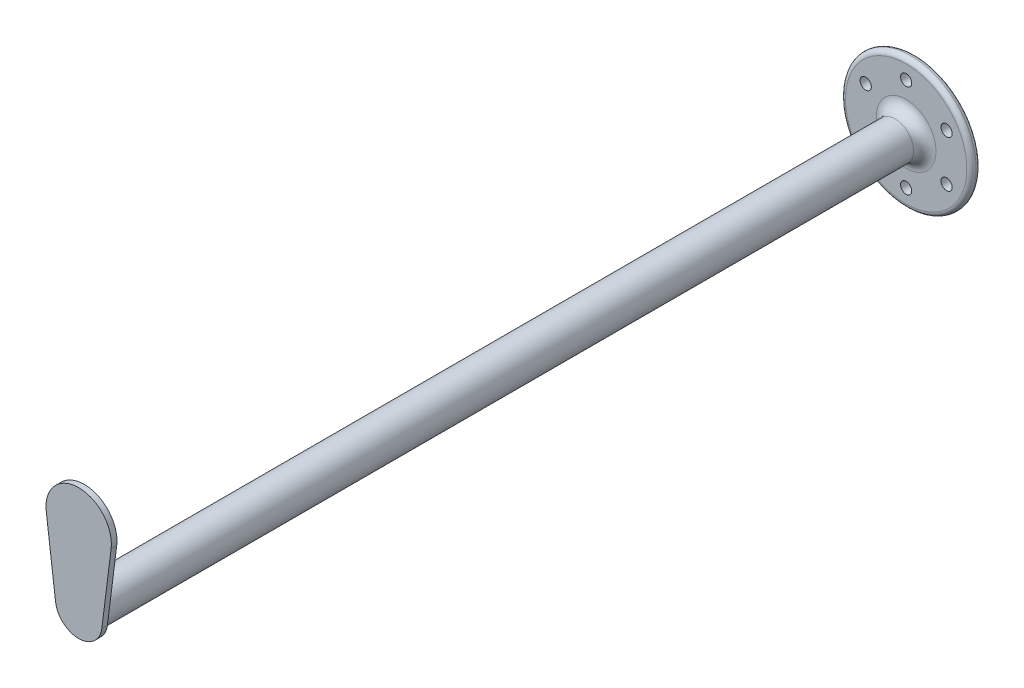
ISO-10303-21;
HEADER;
FILE_DESCRIPTION(('STEP AP214'),'2;1');
FILE_NAME('part.step','',(''),(''),'','','');
FILE_SCHEMA(('AUTOMOTIVE_DESIGN { 1 0 10303 214 1 1 1 1 }'));
ENDSEC;
DATA;
#1=APPLICATION_CONTEXT('core data for automotive mechanical design processes');
#2=APPLICATION_PROTOCOL_DEFINITION('international standard','automotive_design',2000,#1);
#3=PRODUCT_CONTEXT('',#1,'mechanical');
#4=PRODUCT('Part','Part','',(#3));
#5=PRODUCT_RELATED_PRODUCT_CATEGORY('part','',(#4));
#6=PRODUCT_DEFINITION_FORMATION('','',#4);
#7=PRODUCT_DEFINITION_CONTEXT('part definition',#1,'design');
#8=PRODUCT_DEFINITION('design','',#6,#7);
#9=PRODUCT_DEFINITION_SHAPE('','',#8);
#10=(LENGTH_UNIT() NAMED_UNIT(*) SI_UNIT(.MILLI.,.METRE.));
#11=(NAMED_UNIT(*) PLANE_ANGLE_UNIT() SI_UNIT($,.RADIAN.));
#12=(NAMED_UNIT(*) SI_UNIT($,.STERADIAN.) SOLID_ANGLE_UNIT());
#13=UNCERTAINTY_MEASURE_WITH_UNIT(LENGTH_MEASURE(1.E-05),#10,'distance_accuracy_value','');
#14=(GEOMETRIC_REPRESENTATION_CONTEXT(3) GLOBAL_UNCERTAINTY_ASSIGNED_CONTEXT((#13)) GLOBAL_UNIT_ASSIGNED_CONTEXT((#10,
#11,#12)) REPRESENTATION_CONTEXT('',''));
#15=CARTESIAN_POINT('',(0.,0.,0.));
#16=DIRECTION('',(0.,0.,1.));
#17=DIRECTION('',(1.,0.,0.));
#18=AXIS2_PLACEMENT_3D('',#15,#16,#17);
#19=CARTESIAN_POINT('',(0.,0.,558.8));
#20=DIRECTION('',(0.,0.,-1.));
#21=DIRECTION('',(-1.,0.,0.));
#22=AXIS2_PLACEMENT_3D('',#19,#20,#21);
#23=CYLINDRICAL_SURFACE('',#22,12.7);
#24=CARTESIAN_POINT('',(0.,0.,557.53));
#25=DIRECTION('',(0.,0.,1.));
#26=DIRECTION('',(1.,0.,0.));
#27=AXIS2_PLACEMENT_3D('',#24,#25,#26);
#28=CIRCLE('',#27,12.7);
#29=CARTESIAN_POINT('',(12.7,0.,557.53));
#30=VERTEX_POINT('',#29);
#31=EDGE_CURVE('E11',#30,#30,#28,.F.);
#32=ORIENTED_EDGE('',*,*,#31,.T.);
#33=EDGE_LOOP('',(#32));
#34=FACE_BOUND('',#33,.T.);
#35=CARTESIAN_POINT('',(0.,0.,7.61999999999996));
#36=DIRECTION('',(0.,0.,-1.));
#37=DIRECTION('',(-1.,0.,0.));
#38=AXIS2_PLACEMENT_3D('',#35,#36,#37);
#39=CIRCLE('',#38,12.7);
#40=CARTESIAN_POINT('',(-12.7,0.,7.61999999999996));
#41=VERTEX_POINT('',#40);
#42=EDGE_CURVE('E150',#41,#41,#39,.F.);
#43=ORIENTED_EDGE('',*,*,#42,.T.);
#44=EDGE_LOOP('',(#43));
#45=FACE_BOUND('',#44,.T.);
#46=ADVANCED_FACE('F33',(#34,#45),#23,.T.);
#47=CARTESIAN_POINT('',(0.,0.,-6.35));
#48=DIRECTION('',(0.,0.,-1.));
#49=DIRECTION('',(-1.,0.,0.));
#50=AXIS2_PLACEMENT_3D('',#47,#48,#49);
#51=PLANE('',#50);
#52=CARTESIAN_POINT('',(0.,0.,-6.35));
#53=DIRECTION('',(0.,0.,-1.));
#54=DIRECTION('',(-1.,0.,0.));
#55=AXIS2_PLACEMENT_3D('',#52,#53,#54);
#56=CIRCLE('',#55,41.275);
#57=CARTESIAN_POINT('',(-41.275,0.,-6.35));
#58=VERTEX_POINT('',#57);
#59=EDGE_CURVE('E153',#58,#58,#56,.T.);
#60=ORIENTED_EDGE('',*,*,#59,.T.);
#61=EDGE_LOOP('',(#60));
#62=FACE_BOUND('',#61,.T.);
#63=CARTESIAN_POINT('',(27.4963065701532,-15.8750000000016,-6.35));
#64=DIRECTION('',(0.,0.,-1.));
#65=DIRECTION('',(-1.,0.,0.));
#66=AXIS2_PLACEMENT_3D('',#63,#64,#65);
#67=CIRCLE('',#66,3.81000000000333);
#68=CARTESIAN_POINT('',(23.6863065701499,-15.8750000000016,-6.35));
#69=VERTEX_POINT('',#68);
#70=EDGE_CURVE('E118',#69,#69,#67,.T.);
#71=ORIENTED_EDGE('',*,*,#70,.F.);
#72=EDGE_LOOP('',(#71));
#73=FACE_BOUND('',#72,.T.);
#74=CARTESIAN_POINT('',(-27.4963065701586,-15.8749999999984,-6.35));
#75=DIRECTION('',(0.,0.,-1.));
#76=DIRECTION('',(-1.,0.,0.));
#77=AXIS2_PLACEMENT_3D('',#74,#75,#76);
#78=CIRCLE('',#77,3.81000000000228);
#79=CARTESIAN_POINT('',(-31.3063065701609,-15.8749999999984,-6.35));
#80=VERTEX_POINT('',#79);
#81=EDGE_CURVE('E130',#80,#80,#78,.T.);
#82=ORIENTED_EDGE('',*,*,#81,.F.);
#83=EDGE_LOOP('',(#82));
#84=FACE_BOUND('',#83,.T.);
#85=CARTESIAN_POINT('',(0.,31.75,-6.35));
#86=DIRECTION('',(0.,0.,-1.));
#87=DIRECTION('',(-1.,0.,0.));
#88=AXIS2_PLACEMENT_3D('',#85,#86,#87);
#89=CIRCLE('',#88,3.81);
#90=CARTESIAN_POINT('',(-3.81,31.75,-6.35));
#91=VERTEX_POINT('',#90);
#92=EDGE_CURVE('E142',#91,#91,#89,.T.);
#93=ORIENTED_EDGE('',*,*,#92,.F.);
#94=EDGE_LOOP('',(#93));
#95=FACE_BOUND('',#94,.T.);
#96=CARTESIAN_POINT('',(-27.4963065701568,15.8750000000016,-6.35));
#97=DIRECTION('',(0.,0.,-1.));
#98=DIRECTION('',(-1.,0.,0.));
#99=AXIS2_PLACEMENT_3D('',#96,#97,#98);
#100=CIRCLE('',#99,3.81000000000048);
#101=CARTESIAN_POINT('',(-31.3063065701573,15.8750000000016,-6.35));
#102=VERTEX_POINT('',#101);
#103=EDGE_CURVE('E136',#102,#102,#100,.T.);
#104=ORIENTED_EDGE('',*,*,#103,.F.);
#105=EDGE_LOOP('',(#104));
#106=FACE_BOUND('',#105,.T.);
#107=CARTESIAN_POINT('',(-3.60178059048672E-12,-31.75,-6.35));
#108=DIRECTION('',(0.,0.,-1.));
#109=DIRECTION('',(-1.,0.,0.));
#110=AXIS2_PLACEMENT_3D('',#107,#108,#109);
#111=CIRCLE('',#110,3.81000000000366);
#112=CARTESIAN_POINT('',(-3.81000000000726,-31.75,-6.35));
#113=VERTEX_POINT('',#112);
#114=EDGE_CURVE('E124',#113,#113,#111,.T.);
#115=ORIENTED_EDGE('',*,*,#114,.F.);
#116=EDGE_LOOP('',(#115));
#117=FACE_BOUND('',#116,.T.);
#118=CARTESIAN_POINT('',(27.496306570155,15.8749999999984,-6.35));
#119=DIRECTION('',(0.,0.,-1.));
#120=DIRECTION('',(-1.,0.,0.));
#121=AXIS2_PLACEMENT_3D('',#118,#119,#120);
#122=CIRCLE('',#121,3.8100000000017);
#123=CARTESIAN_POINT('',(23.6863065701533,15.8749999999984,-6.35));
#124=VERTEX_POINT('',#123);
#125=EDGE_CURVE('E111',#124,#124,#122,.T.);
#126=ORIENTED_EDGE('',*,*,#125,.F.);
#127=EDGE_LOOP('',(#126));
#128=FACE_BOUND('',#127,.T.);
#129=ADVANCED_FACE('F174',(#62,#73,#84,#95,#106,#117,#128),#51,.T.);
#130=CARTESIAN_POINT('',(0.,0.,0.));
#131=DIRECTION('',(0.,0.,-1.));
#132=DIRECTION('',(-1.,0.,0.));
#133=AXIS2_PLACEMENT_3D('',#130,#131,#132);
#134=PLANE('',#133);
#135=CARTESIAN_POINT('',(0.,0.,0.));
#136=DIRECTION('',(0.,0.,-1.));
#137=DIRECTION('',(-1.,0.,0.));
#138=AXIS2_PLACEMENT_3D('',#135,#136,#137);
#139=CIRCLE('',#138,41.275);
#140=CARTESIAN_POINT('',(-41.275,0.,0.));
#141=VERTEX_POINT('',#140);
#142=EDGE_CURVE('E156',#141,#141,#139,.F.);
#143=ORIENTED_EDGE('',*,*,#142,.T.);
#144=EDGE_LOOP('',(#143));
#145=FACE_BOUND('',#144,.T.);
#146=CARTESIAN_POINT('',(0.,0.,0.));
#147=DIRECTION('',(0.,0.,-1.));
#148=DIRECTION('',(-1.,0.,0.));
#149=AXIS2_PLACEMENT_3D('',#146,#147,#148);
#150=CIRCLE('',#149,20.32);
#151=CARTESIAN_POINT('',(-20.32,0.,0.));
#152=VERTEX_POINT('',#151);
#153=EDGE_CURVE('E145',#152,#152,#150,.T.);
#154=ORIENTED_EDGE('',*,*,#153,.T.);
#155=EDGE_LOOP('',(#154));
#156=FACE_BOUND('',#155,.T.);
#157=CARTESIAN_POINT('',(0.,31.75,0.));
#158=DIRECTION('',(0.,0.,-1.));
#159=DIRECTION('',(-1.,0.,0.));
#160=AXIS2_PLACEMENT_3D('',#157,#158,#159);
#161=CIRCLE('',#160,3.81);
#162=CARTESIAN_POINT('',(-3.81,31.75,0.));
#163=VERTEX_POINT('',#162);
#164=EDGE_CURVE('E139',#163,#163,#161,.T.);
#165=ORIENTED_EDGE('',*,*,#164,.T.);
#166=EDGE_LOOP('',(#165));
#167=FACE_BOUND('',#166,.T.);
#168=CARTESIAN_POINT('',(-27.4963065701568,15.8750000000016,0.));
#169=DIRECTION('',(0.,0.,-1.));
#170=DIRECTION('',(-1.,0.,0.));
#171=AXIS2_PLACEMENT_3D('',#168,#169,#170);
#172=CIRCLE('',#171,3.81000000000048);
#173=CARTESIAN_POINT('',(-31.3063065701573,15.8750000000016,0.));
#174=VERTEX_POINT('',#173);
#175=EDGE_CURVE('E133',#174,#174,#172,.T.);
#176=ORIENTED_EDGE('',*,*,#175,.T.);
#177=EDGE_LOOP('',(#176));
#178=FACE_BOUND('',#177,.T.);
#179=CARTESIAN_POINT('',(-27.4963065701586,-15.8749999999984,0.));
#180=DIRECTION('',(0.,0.,-1.));
#181=DIRECTION('',(-1.,0.,0.));
#182=AXIS2_PLACEMENT_3D('',#179,#180,#181);
#183=CIRCLE('',#182,3.81000000000228);
#184=CARTESIAN_POINT('',(-31.3063065701609,-15.8749999999984,0.));
#185=VERTEX_POINT('',#184);
#186=EDGE_CURVE('E127',#185,#185,#183,.T.);
#187=ORIENTED_EDGE('',*,*,#186,.T.);
#188=EDGE_LOOP('',(#187));
#189=FACE_BOUND('',#188,.T.);
#190=CARTESIAN_POINT('',(-3.60178059048672E-12,-31.75,0.));
#191=DIRECTION('',(0.,0.,-1.));
#192=DIRECTION('',(-1.,0.,0.));
#193=AXIS2_PLACEMENT_3D('',#190,#191,#192);
#194=CIRCLE('',#193,3.81000000000366);
#195=CARTESIAN_POINT('',(-3.81000000000726,-31.75,0.));
#196=VERTEX_POINT('',#195);
#197=EDGE_CURVE('E121',#196,#196,#194,.T.);
#198=ORIENTED_EDGE('',*,*,#197,.T.);
#199=EDGE_LOOP('',(#198));
#200=FACE_BOUND('',#199,.T.);
#201=CARTESIAN_POINT('',(27.4963065701532,-15.8750000000016,0.));
#202=DIRECTION('',(0.,0.,-1.));
#203=DIRECTION('',(-1.,0.,0.));
#204=AXIS2_PLACEMENT_3D('',#201,#202,#203);
#205=CIRCLE('',#204,3.81000000000333);
#206=CARTESIAN_POINT('',(23.6863065701499,-15.8750000000016,0.));
#207=VERTEX_POINT('',#206);
#208=EDGE_CURVE('E114',#207,#207,#205,.T.);
#209=ORIENTED_EDGE('',*,*,#208,.T.);
#210=EDGE_LOOP('',(#209));
#211=FACE_BOUND('',#210,.T.);
#212=CARTESIAN_POINT('',(27.496306570155,15.8749999999984,0.));
#213=DIRECTION('',(0.,0.,-1.));
#214=DIRECTION('',(-1.,0.,0.));
#215=AXIS2_PLACEMENT_3D('',#212,#213,#214);
#216=CIRCLE('',#215,3.8100000000017);
#217=CARTESIAN_POINT('',(23.6863065701533,15.8749999999984,0.));
#218=VERTEX_POINT('',#217);
#219=EDGE_CURVE('E115',#218,#218,#216,.T.);
#220=ORIENTED_EDGE('',*,*,#219,.T.);
#221=EDGE_LOOP('',(#220));
#222=FACE_BOUND('',#221,.T.);
#223=ADVANCED_FACE('F180',(#145,#156,#167,#178,#189,#200,#211,#222),#134,.F.);
#224=CARTESIAN_POINT('',(0.,31.75,-6.35));
#225=DIRECTION('',(0.,0.,1.));
#226=DIRECTION('',(1.,0.,0.));
#227=AXIS2_PLACEMENT_3D('',#224,#225,#226);
#228=CYLINDRICAL_SURFACE('',#227,3.81);
#229=ORIENTED_EDGE('',*,*,#92,.T.);
#230=EDGE_LOOP('',(#229));
#231=FACE_BOUND('',#230,.T.);
#232=ORIENTED_EDGE('',*,*,#164,.F.);
#233=EDGE_LOOP('',(#232));
#234=FACE_BOUND('',#233,.T.);
#235=ADVANCED_FACE('F225',(#231,#234),#228,.F.);
#236=CARTESIAN_POINT('',(-27.4963065701568,15.8750000000016,-6.35));
#237=DIRECTION('',(0.,0.,1.));
#238=DIRECTION('',(1.,0.,0.));
#239=AXIS2_PLACEMENT_3D('',#236,#237,#238);
#240=CYLINDRICAL_SURFACE('',#239,3.81000000000048);
#241=ORIENTED_EDGE('',*,*,#103,.T.);
#242=EDGE_LOOP('',(#241));
#243=FACE_BOUND('',#242,.T.);
#244=ORIENTED_EDGE('',*,*,#175,.F.);
#245=EDGE_LOOP('',(#244));
#246=FACE_BOUND('',#245,.T.);
#247=ADVANCED_FACE('F230',(#243,#246),#240,.F.);
#248=CARTESIAN_POINT('',(-27.4963065701586,-15.8749999999984,-6.35));
#249=DIRECTION('',(0.,0.,1.));
#250=DIRECTION('',(1.,0.,0.));
#251=AXIS2_PLACEMENT_3D('',#248,#249,#250);
#252=CYLINDRICAL_SURFACE('',#251,3.81000000000228);
#253=ORIENTED_EDGE('',*,*,#81,.T.);
#254=EDGE_LOOP('',(#253));
#255=FACE_BOUND('',#254,.T.);
#256=ORIENTED_EDGE('',*,*,#186,.F.);
#257=EDGE_LOOP('',(#256));
#258=FACE_BOUND('',#257,.T.);
#259=ADVANCED_FACE('F253',(#255,#258),#252,.F.);
#260=CARTESIAN_POINT('',(-3.60178059048672E-12,-31.75,-6.35));
#261=DIRECTION('',(0.,0.,1.));
#262=DIRECTION('',(1.,0.,0.));
#263=AXIS2_PLACEMENT_3D('',#260,#261,#262);
#264=CYLINDRICAL_SURFACE('',#263,3.81000000000366);
#265=ORIENTED_EDGE('',*,*,#114,.T.);
#266=EDGE_LOOP('',(#265));
#267=FACE_BOUND('',#266,.T.);
#268=ORIENTED_EDGE('',*,*,#197,.F.);
#269=EDGE_LOOP('',(#268));
#270=FACE_BOUND('',#269,.T.);
#271=ADVANCED_FACE('F247',(#267,#270),#264,.F.);
#272=CARTESIAN_POINT('',(27.4963065701532,-15.8750000000016,-6.35));
#273=DIRECTION('',(0.,0.,1.));
#274=DIRECTION('',(1.,0.,0.));
#275=AXIS2_PLACEMENT_3D('',#272,#273,#274);
#276=CYLINDRICAL_SURFACE('',#275,3.81000000000333);
#277=ORIENTED_EDGE('',*,*,#70,.T.);
#278=EDGE_LOOP('',(#277));
#279=FACE_BOUND('',#278,.T.);
#280=ORIENTED_EDGE('',*,*,#208,.F.);
#281=EDGE_LOOP('',(#280));
#282=FACE_BOUND('',#281,.T.);
#283=ADVANCED_FACE('F220',(#279,#282),#276,.F.);
#284=CARTESIAN_POINT('',(27.496306570155,15.8749999999984,-6.35));
#285=DIRECTION('',(0.,0.,1.));
#286=DIRECTION('',(1.,0.,0.));
#287=AXIS2_PLACEMENT_3D('',#284,#285,#286);
#288=CYLINDRICAL_SURFACE('',#287,3.8100000000017);
#289=ORIENTED_EDGE('',*,*,#125,.T.);
#290=EDGE_LOOP('',(#289));
#291=FACE_BOUND('',#290,.T.);
#292=ORIENTED_EDGE('',*,*,#219,.F.);
#293=EDGE_LOOP('',(#292));
#294=FACE_BOUND('',#293,.T.);
#295=ADVANCED_FACE('F190',(#291,#294),#288,.F.);
#296=CARTESIAN_POINT('',(0.,0.,7.61999999999996));
#297=DIRECTION('',(0.,0.,-1.));
#298=DIRECTION('',(-1.,0.,0.));
#299=AXIS2_PLACEMENT_3D('',#296,#297,#298);
#300=TOROIDAL_SURFACE('',#299,20.32,7.62);
#301=ORIENTED_EDGE('',*,*,#42,.F.);
#302=EDGE_LOOP('',(#301));
#303=FACE_BOUND('',#302,.T.);
#304=ORIENTED_EDGE('',*,*,#153,.F.);
#305=EDGE_LOOP('',(#304));
#306=FACE_BOUND('',#305,.T.);
#307=ADVANCED_FACE('F186',(#303,#306),#300,.F.);
#308=CARTESIAN_POINT('',(0.,0.,-3.175));
#309=DIRECTION('',(0.,0.,-1.));
#310=DIRECTION('',(-1.,0.,0.));
#311=AXIS2_PLACEMENT_3D('',#308,#309,#310);
#312=TOROIDAL_SURFACE('',#311,41.275,3.175);
#313=ORIENTED_EDGE('',*,*,#142,.F.);
#314=EDGE_LOOP('',(#313));
#315=FACE_BOUND('',#314,.T.);
#316=CARTESIAN_POINT('',(0.,0.,-3.175));
#317=DIRECTION('',(0.,0.,-1.));
#318=DIRECTION('',(-1.,0.,0.));
#319=AXIS2_PLACEMENT_3D('',#316,#317,#318);
#320=CIRCLE('',#319,44.45);
#321=CARTESIAN_POINT('',(-44.45,0.,-3.175));
#322=VERTEX_POINT('',#321);
#323=EDGE_CURVE('E110',#322,#322,#320,.T.);
#324=ORIENTED_EDGE('',*,*,#323,.F.);
#325=EDGE_LOOP('',(#324));
#326=FACE_BOUND('',#325,.T.);
#327=ADVANCED_FACE('F189',(#315,#326),#312,.T.);
#328=CARTESIAN_POINT('',(0.,0.,-3.175));
#329=DIRECTION('',(0.,0.,-1.));
#330=DIRECTION('',(-1.,0.,0.));
#331=AXIS2_PLACEMENT_3D('',#328,#329,#330);
#332=TOROIDAL_SURFACE('',#331,41.275,3.175);
#333=ORIENTED_EDGE('',*,*,#323,.T.);
#334=EDGE_LOOP('',(#333));
#335=FACE_BOUND('',#334,.T.);
#336=ORIENTED_EDGE('',*,*,#59,.F.);
#337=EDGE_LOOP('',(#336));
#338=FACE_BOUND('',#337,.T.);
#339=ADVANCED_FACE('F192',(#335,#338),#332,.T.);
#340=CARTESIAN_POINT('',(0.,0.,562.61));
#341=DIRECTION('',(0.,0.,-1.));
#342=DIRECTION('',(-1.,0.,0.));
#343=AXIS2_PLACEMENT_3D('',#340,#341,#342);
#344=CYLINDRICAL_SURFACE('',#343,15.875);
#345=CARTESIAN_POINT('',(0.,0.,558.8));
#346=DIRECTION('',(0.,0.,1.));
#347=DIRECTION('',(1.,0.,0.));
#348=AXIS2_PLACEMENT_3D('',#345,#346,#347);
#349=CIRCLE('',#348,15.875);
#350=CARTESIAN_POINT('',(-15.7504882736814,-1.984375,558.8));
#351=VERTEX_POINT('',#350);
#352=CARTESIAN_POINT('',(15.7504882736814,-1.984375,558.8));
#353=VERTEX_POINT('',#352);
#354=EDGE_CURVE('E101',#351,#353,#349,.T.);
#355=ORIENTED_EDGE('',*,*,#354,.T.);
#356=DIRECTION('',(0.,0.,-1.));
#357=VECTOR('',#356,1.);
#358=CARTESIAN_POINT('',(15.7504882736814,-1.984375,562.61));
#359=LINE('',#358,#357);
#360=CARTESIAN_POINT('',(15.7504882736814,-1.984375,562.61));
#361=VERTEX_POINT('',#360);
#362=EDGE_CURVE('E92',#361,#353,#359,.T.);
#363=ORIENTED_EDGE('',*,*,#362,.F.);
#364=CARTESIAN_POINT('',(0.,0.,562.61));
#365=DIRECTION('',(0.,0.,1.));
#366=DIRECTION('',(1.,0.,0.));
#367=AXIS2_PLACEMENT_3D('',#364,#365,#366);
#368=CIRCLE('',#367,15.875);
#369=CARTESIAN_POINT('',(-15.7504882736814,-1.984375,562.61));
#370=VERTEX_POINT('',#369);
#371=EDGE_CURVE('E86',#370,#361,#368,.T.);
#372=ORIENTED_EDGE('',*,*,#371,.F.);
#373=DIRECTION('',(0.,0.,-1.));
#374=VECTOR('',#373,1.);
#375=CARTESIAN_POINT('',(-15.7504882736814,-1.984375,562.61));
#376=LINE('',#375,#374);
#377=EDGE_CURVE('E97',#370,#351,#376,.T.);
#378=ORIENTED_EDGE('',*,*,#377,.T.);
#379=EDGE_LOOP('',(#355,#363,#372,#378));
#380=FACE_BOUND('',#379,.T.);
#381=ADVANCED_FACE('F194',(#380),#344,.T.);
#382=CARTESIAN_POINT('',(15.7504882736814,-1.984375,562.61));
#383=DIRECTION('',(-0.992156741649222,0.125,0.));
#384=DIRECTION('',(-0.125,-0.992156741649222,0.));
#385=AXIS2_PLACEMENT_3D('',#382,#383,#384);
#386=PLANE('',#385);
#387=DIRECTION('',(0.125,0.992156741649221,0.));
#388=VECTOR('',#387,1.);
#389=CARTESIAN_POINT('',(15.7504882736814,-1.984375,558.8));
#390=LINE('',#389,#388);
#391=CARTESIAN_POINT('',(22.0506835831539,48.021875,558.8));
#392=VERTEX_POINT('',#391);
#393=EDGE_CURVE('E91',#353,#392,#390,.T.);
#394=ORIENTED_EDGE('',*,*,#393,.T.);
#395=DIRECTION('',(0.,0.,-1.));
#396=VECTOR('',#395,1.);
#397=CARTESIAN_POINT('',(22.0506835831539,48.021875,562.61));
#398=LINE('',#397,#396);
#399=CARTESIAN_POINT('',(22.0506835831539,48.021875,562.61));
#400=VERTEX_POINT('',#399);
#401=EDGE_CURVE('E89',#400,#392,#398,.T.);
#402=ORIENTED_EDGE('',*,*,#401,.F.);
#403=DIRECTION('',(0.125,0.992156741649221,0.));
#404=VECTOR('',#403,1.);
#405=CARTESIAN_POINT('',(15.7504882736814,-1.984375,562.61));
#406=LINE('',#405,#404);
#407=EDGE_CURVE('E81',#361,#400,#406,.T.);
#408=ORIENTED_EDGE('',*,*,#407,.F.);
#409=ORIENTED_EDGE('',*,*,#362,.T.);
#410=EDGE_LOOP('',(#394,#402,#408,#409));
#411=FACE_BOUND('',#410,.T.);
#412=ADVANCED_FACE('F90',(#411),#386,.F.);
#413=CARTESIAN_POINT('',(0.,50.8,562.61));
#414=DIRECTION('',(0.,0.,-1.));
#415=DIRECTION('',(-1.,0.,0.));
#416=AXIS2_PLACEMENT_3D('',#413,#414,#415);
#417=CYLINDRICAL_SURFACE('',#416,22.225);
#418=CARTESIAN_POINT('',(0.,50.8,558.8));
#419=DIRECTION('',(0.,0.,1.));
#420=DIRECTION('',(1.,0.,0.));
#421=AXIS2_PLACEMENT_3D('',#418,#419,#420);
#422=CIRCLE('',#421,22.225);
#423=CARTESIAN_POINT('',(-22.0506835831539,48.021875,558.8));
#424=VERTEX_POINT('',#423);
#425=EDGE_CURVE('E67',#392,#424,#422,.T.);
#426=ORIENTED_EDGE('',*,*,#425,.T.);
#427=DIRECTION('',(0.,0.,-1.));
#428=VECTOR('',#427,1.);
#429=CARTESIAN_POINT('',(-22.0506835831539,48.021875,562.61));
#430=LINE('',#429,#428);
#431=CARTESIAN_POINT('',(-22.0506835831539,48.021875,562.61));
#432=VERTEX_POINT('',#431);
#433=EDGE_CURVE('E93',#432,#424,#430,.T.);
#434=ORIENTED_EDGE('',*,*,#433,.F.);
#435=CARTESIAN_POINT('',(0.,50.8,562.61));
#436=DIRECTION('',(0.,0.,1.));
#437=DIRECTION('',(1.,0.,0.));
#438=AXIS2_PLACEMENT_3D('',#435,#436,#437);
#439=CIRCLE('',#438,22.225);
#440=EDGE_CURVE('E84',#400,#432,#439,.T.);
#441=ORIENTED_EDGE('',*,*,#440,.F.);
#442=ORIENTED_EDGE('',*,*,#401,.T.);
#443=EDGE_LOOP('',(#426,#434,#441,#442));
#444=FACE_BOUND('',#443,.T.);
#445=ADVANCED_FACE('F95',(#444),#417,.T.);
#446=CARTESIAN_POINT('',(-15.7504882736814,-1.984375,562.61));
#447=DIRECTION('',(0.992156741649222,0.125,0.));
#448=DIRECTION('',(-0.125,0.992156741649222,0.));
#449=AXIS2_PLACEMENT_3D('',#446,#447,#448);
#450=PLANE('',#449);
#451=DIRECTION('',(0.125,-0.992156741649221,0.));
#452=VECTOR('',#451,1.);
#453=CARTESIAN_POINT('',(-15.7504882736814,-1.984375,558.8));
#454=LINE('',#453,#452);
#455=EDGE_CURVE('E73',#424,#351,#454,.T.);
#456=ORIENTED_EDGE('',*,*,#455,.T.);
#457=ORIENTED_EDGE('',*,*,#377,.F.);
#458=DIRECTION('',(0.125,-0.992156741649221,0.));
#459=VECTOR('',#458,1.);
#460=CARTESIAN_POINT('',(-15.7504882736814,-1.984375,562.61));
#461=LINE('',#460,#459);
#462=EDGE_CURVE('E50',#432,#370,#461,.T.);
#463=ORIENTED_EDGE('',*,*,#462,.F.);
#464=ORIENTED_EDGE('',*,*,#433,.T.);
#465=EDGE_LOOP('',(#456,#457,#463,#464));
#466=FACE_BOUND('',#465,.T.);
#467=ADVANCED_FACE('F339',(#466),#450,.F.);
#468=CARTESIAN_POINT('',(0.,0.,562.61));
#469=DIRECTION('',(0.,0.,1.));
#470=DIRECTION('',(1.,0.,0.));
#471=AXIS2_PLACEMENT_3D('',#468,#469,#470);
#472=PLANE('',#471);
#473=ORIENTED_EDGE('',*,*,#371,.T.);
#474=ORIENTED_EDGE('',*,*,#407,.T.);
#475=ORIENTED_EDGE('',*,*,#440,.T.);
#476=ORIENTED_EDGE('',*,*,#462,.T.);
#477=EDGE_LOOP('',(#473,#474,#475,#476));
#478=FACE_BOUND('',#477,.T.);
#479=ADVANCED_FACE('F82',(#478),#472,.T.);
#480=CARTESIAN_POINT('',(0.,0.,558.8));
#481=DIRECTION('',(0.,0.,1.));
#482=DIRECTION('',(1.,0.,0.));
#483=AXIS2_PLACEMENT_3D('',#480,#481,#482);
#484=PLANE('',#483);
#485=CARTESIAN_POINT('',(0.,0.,558.8));
#486=DIRECTION('',(0.,0.,1.));
#487=DIRECTION('',(1.,0.,0.));
#488=AXIS2_PLACEMENT_3D('',#485,#486,#487);
#489=CIRCLE('',#488,13.97);
#490=CARTESIAN_POINT('',(13.97,0.,558.8));
#491=VERTEX_POINT('',#490);
#492=EDGE_CURVE('E42',#491,#491,#489,.T.);
#493=ORIENTED_EDGE('',*,*,#492,.T.);
#494=EDGE_LOOP('',(#493));
#495=FACE_BOUND('',#494,.T.);
#496=ORIENTED_EDGE('',*,*,#354,.F.);
#497=ORIENTED_EDGE('',*,*,#455,.F.);
#498=ORIENTED_EDGE('',*,*,#425,.F.);
#499=ORIENTED_EDGE('',*,*,#393,.F.);
#500=EDGE_LOOP('',(#496,#497,#498,#499));
#501=FACE_BOUND('',#500,.T.);
#502=ADVANCED_FACE('F163',(#495,#501),#484,.F.);
#503=CARTESIAN_POINT('',(0.,0.,557.53));
#504=DIRECTION('',(0.,0.,1.));
#505=DIRECTION('',(1.,0.,0.));
#506=AXIS2_PLACEMENT_3D('',#503,#504,#505);
#507=TOROIDAL_SURFACE('',#506,13.97,1.27);
#508=ORIENTED_EDGE('',*,*,#31,.F.);
#509=EDGE_LOOP('',(#508));
#510=FACE_BOUND('',#509,.T.);
#511=ORIENTED_EDGE('',*,*,#492,.F.);
#512=EDGE_LOOP('',(#511));
#513=FACE_BOUND('',#512,.T.);
#514=ADVANCED_FACE('F35',(#510,#513),#507,.F.);
#515=CLOSED_SHELL('',(#46,#129,#223,#235,#247,#259,#271,#283,#295,#307,#327,#339,#381,#412,#445,
#467,#479,#502,#514));
#516=MANIFOLD_SOLID_BREP('B2',#515);
#517=ADVANCED_BREP_SHAPE_REPRESENTATION('',(#18,#516),#14);
#518=SHAPE_DEFINITION_REPRESENTATION(#9,#517);
ENDSEC;
END-ISO-10303-21;
